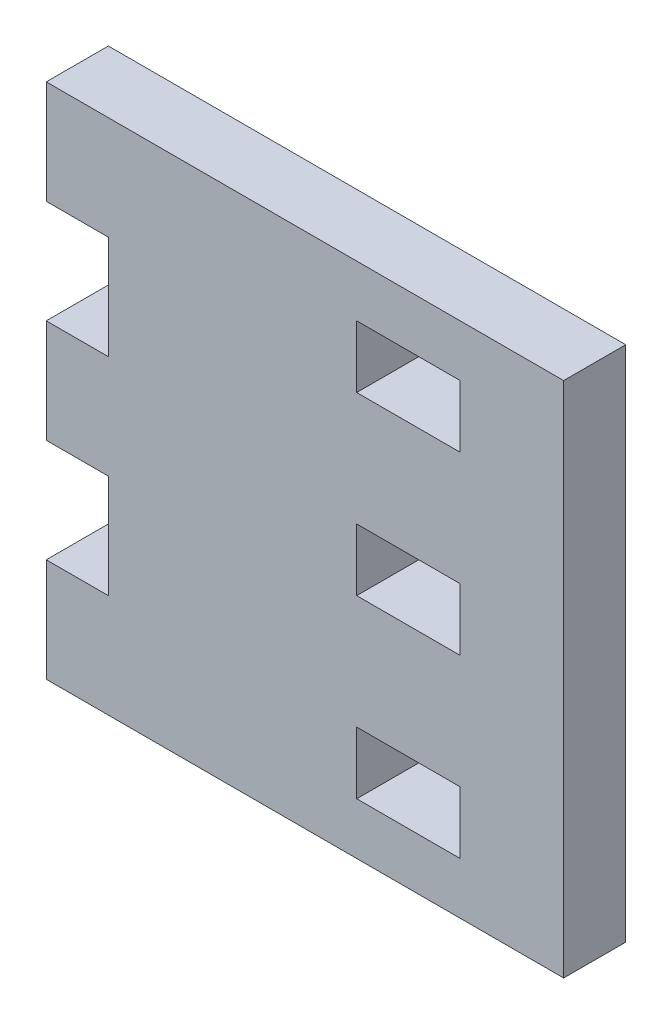
ISO-10303-21;
HEADER;
FILE_DESCRIPTION(('STEP AP214'),'2;1');
FILE_NAME('part.step','',(''),(''),'','','');
FILE_SCHEMA(('AUTOMOTIVE_DESIGN { 1 0 10303 214 1 1 1 1 }'));
ENDSEC;
DATA;
#1=APPLICATION_CONTEXT('core data for automotive mechanical design processes');
#2=APPLICATION_PROTOCOL_DEFINITION('international standard','automotive_design',2000,#1);
#3=PRODUCT_CONTEXT('',#1,'mechanical');
#4=PRODUCT('Part','Part','',(#3));
#5=PRODUCT_RELATED_PRODUCT_CATEGORY('part','',(#4));
#6=PRODUCT_DEFINITION_FORMATION('','',#4);
#7=PRODUCT_DEFINITION_CONTEXT('part definition',#1,'design');
#8=PRODUCT_DEFINITION('design','',#6,#7);
#9=PRODUCT_DEFINITION_SHAPE('','',#8);
#10=(LENGTH_UNIT() NAMED_UNIT(*) SI_UNIT(.MILLI.,.METRE.));
#11=(NAMED_UNIT(*) PLANE_ANGLE_UNIT() SI_UNIT($,.RADIAN.));
#12=(NAMED_UNIT(*) SI_UNIT($,.STERADIAN.) SOLID_ANGLE_UNIT());
#13=UNCERTAINTY_MEASURE_WITH_UNIT(LENGTH_MEASURE(1.E-05),#10,'distance_accuracy_value','');
#14=(GEOMETRIC_REPRESENTATION_CONTEXT(3) GLOBAL_UNCERTAINTY_ASSIGNED_CONTEXT((#13)) GLOBAL_UNIT_ASSIGNED_CONTEXT((#10,
#11,#12)) REPRESENTATION_CONTEXT('',''));
#15=CARTESIAN_POINT('',(0.,0.,0.));
#16=DIRECTION('',(0.,0.,1.));
#17=DIRECTION('',(1.,0.,0.));
#18=AXIS2_PLACEMENT_3D('',#15,#16,#17);
#19=CARTESIAN_POINT('',(0.,0.,6.));
#20=DIRECTION('',(0.,0.,1.));
#21=DIRECTION('',(1.,0.,0.));
#22=AXIS2_PLACEMENT_3D('',#19,#20,#21);
#23=PLANE('',#22);
#24=DIRECTION('',(0.,-1.,0.));
#25=VECTOR('',#24,1.);
#26=CARTESIAN_POINT('',(-26.3628985430743,32.763671875,6.));
#27=LINE('',#26,#25);
#28=CARTESIAN_POINT('',(-26.3628985430743,32.763671875,6.));
#29=VERTEX_POINT('',#28);
#30=CARTESIAN_POINT('',(-26.3628985430743,22.763671875,6.));
#31=VERTEX_POINT('',#30);
#32=EDGE_CURVE('E292',#29,#31,#27,.T.);
#33=ORIENTED_EDGE('',*,*,#32,.T.);
#34=DIRECTION('',(1.,0.,0.));
#35=VECTOR('',#34,1.);
#36=CARTESIAN_POINT('',(-26.3628985430743,22.763671875,6.));
#37=LINE('',#36,#35);
#38=CARTESIAN_POINT('',(-20.3628985430743,22.763671875,6.));
#39=VERTEX_POINT('',#38);
#40=EDGE_CURVE('E295',#31,#39,#37,.T.);
#41=ORIENTED_EDGE('',*,*,#40,.T.);
#42=DIRECTION('',(0.,-1.,0.));
#43=VECTOR('',#42,1.);
#44=CARTESIAN_POINT('',(-20.3628985430743,22.763671875,6.));
#45=LINE('',#44,#43);
#46=CARTESIAN_POINT('',(-20.3628985430743,12.763671875,6.));
#47=VERTEX_POINT('',#46);
#48=EDGE_CURVE('E298',#39,#47,#45,.T.);
#49=ORIENTED_EDGE('',*,*,#48,.T.);
#50=DIRECTION('',(-1.,0.,0.));
#51=VECTOR('',#50,1.);
#52=CARTESIAN_POINT('',(-26.3628985430743,12.763671875,6.));
#53=LINE('',#52,#51);
#54=CARTESIAN_POINT('',(-26.3628985430743,12.763671875,6.));
#55=VERTEX_POINT('',#54);
#56=EDGE_CURVE('E300',#47,#55,#53,.T.);
#57=ORIENTED_EDGE('',*,*,#56,.T.);
#58=DIRECTION('',(0.,-1.,0.));
#59=VECTOR('',#58,1.);
#60=CARTESIAN_POINT('',(-26.3628985430743,12.763671875,6.));
#61=LINE('',#60,#59);
#62=CARTESIAN_POINT('',(-26.362898543074,2.76367187500001,6.));
#63=VERTEX_POINT('',#62);
#64=EDGE_CURVE('E302',#55,#63,#61,.T.);
#65=ORIENTED_EDGE('',*,*,#64,.T.);
#66=DIRECTION('',(1.,0.,0.));
#67=VECTOR('',#66,1.);
#68=CARTESIAN_POINT('',(-26.362898543074,2.76367187500001,6.));
#69=LINE('',#68,#67);
#70=CARTESIAN_POINT('',(-20.362898543074,2.76367187500001,6.));
#71=VERTEX_POINT('',#70);
#72=EDGE_CURVE('E304',#63,#71,#69,.T.);
#73=ORIENTED_EDGE('',*,*,#72,.T.);
#74=DIRECTION('',(0.,-1.,0.));
#75=VECTOR('',#74,1.);
#76=CARTESIAN_POINT('',(-20.362898543074,2.76367187500001,6.));
#77=LINE('',#76,#75);
#78=CARTESIAN_POINT('',(-20.362898543074,-7.23632812499999,6.));
#79=VERTEX_POINT('',#78);
#80=EDGE_CURVE('E306',#71,#79,#77,.T.);
#81=ORIENTED_EDGE('',*,*,#80,.T.);
#82=DIRECTION('',(-1.,0.,0.));
#83=VECTOR('',#82,1.);
#84=CARTESIAN_POINT('',(-26.362898543074,-7.23632812499999,6.));
#85=LINE('',#84,#83);
#86=CARTESIAN_POINT('',(-26.362898543074,-7.23632812499999,6.));
#87=VERTEX_POINT('',#86);
#88=EDGE_CURVE('E308',#79,#87,#85,.T.);
#89=ORIENTED_EDGE('',*,*,#88,.T.);
#90=DIRECTION('',(0.,-1.,0.));
#91=VECTOR('',#90,1.);
#92=CARTESIAN_POINT('',(-26.362898543074,-7.23632812499999,6.));
#93=LINE('',#92,#91);
#94=CARTESIAN_POINT('',(-26.3628985430743,-17.236328125,6.));
#95=VERTEX_POINT('',#94);
#96=EDGE_CURVE('E310',#87,#95,#93,.T.);
#97=ORIENTED_EDGE('',*,*,#96,.T.);
#98=DIRECTION('',(1.,0.,0.));
#99=VECTOR('',#98,1.);
#100=CARTESIAN_POINT('',(-26.3628985430743,-17.236328125,6.));
#101=LINE('',#100,#99);
#102=CARTESIAN_POINT('',(23.6371014569257,-17.236328125,6.));
#103=VERTEX_POINT('',#102);
#104=EDGE_CURVE('E312',#95,#103,#101,.T.);
#105=ORIENTED_EDGE('',*,*,#104,.T.);
#106=DIRECTION('',(0.,1.,0.));
#107=VECTOR('',#106,1.);
#108=CARTESIAN_POINT('',(23.6371014569257,32.763671875,6.));
#109=LINE('',#108,#107);
#110=CARTESIAN_POINT('',(23.6371014569257,32.763671875,6.));
#111=VERTEX_POINT('',#110);
#112=EDGE_CURVE('E314',#103,#111,#109,.T.);
#113=ORIENTED_EDGE('',*,*,#112,.T.);
#114=DIRECTION('',(-1.,0.,0.));
#115=VECTOR('',#114,1.);
#116=CARTESIAN_POINT('',(-26.3628985430743,32.763671875,6.));
#117=LINE('',#116,#115);
#118=EDGE_CURVE('E316',#111,#29,#117,.T.);
#119=ORIENTED_EDGE('',*,*,#118,.T.);
#120=EDGE_LOOP('',(#33,#41,#49,#57,#65,#73,#81,#89,#97,#105,#113,#119));
#121=FACE_BOUND('',#120,.T.);
#122=DIRECTION('',(1.,0.,0.));
#123=VECTOR('',#122,1.);
#124=CARTESIAN_POINT('',(3.63710145692571,21.763671875,6.));
#125=LINE('',#124,#123);
#126=CARTESIAN_POINT('',(3.63710145692571,21.763671875,6.));
#127=VERTEX_POINT('',#126);
#128=CARTESIAN_POINT('',(13.6371014569257,21.763671875,6.));
#129=VERTEX_POINT('',#128);
#130=EDGE_CURVE('E263',#127,#129,#125,.T.);
#131=ORIENTED_EDGE('',*,*,#130,.F.);
#132=DIRECTION('',(0.,-1.,0.));
#133=VECTOR('',#132,1.);
#134=CARTESIAN_POINT('',(3.63710145692571,27.763671875,6.));
#135=LINE('',#134,#133);
#136=CARTESIAN_POINT('',(3.63710145692571,27.763671875,6.));
#137=VERTEX_POINT('',#136);
#138=EDGE_CURVE('E261',#137,#127,#135,.T.);
#139=ORIENTED_EDGE('',*,*,#138,.F.);
#140=DIRECTION('',(-1.,0.,0.));
#141=VECTOR('',#140,1.);
#142=CARTESIAN_POINT('',(3.63710145692571,27.763671875,6.));
#143=LINE('',#142,#141);
#144=CARTESIAN_POINT('',(13.6371014569257,27.763671875,6.));
#145=VERTEX_POINT('',#144);
#146=EDGE_CURVE('E269',#145,#137,#143,.T.);
#147=ORIENTED_EDGE('',*,*,#146,.F.);
#148=DIRECTION('',(0.,1.,0.));
#149=VECTOR('',#148,1.);
#150=CARTESIAN_POINT('',(13.6371014569257,27.763671875,6.));
#151=LINE('',#150,#149);
#152=EDGE_CURVE('E266',#129,#145,#151,.T.);
#153=ORIENTED_EDGE('',*,*,#152,.F.);
#154=EDGE_LOOP('',(#131,#139,#147,#153));
#155=FACE_BOUND('',#154,.T.);
#156=DIRECTION('',(0.,-1.,0.));
#157=VECTOR('',#156,1.);
#158=CARTESIAN_POINT('',(3.63710145692595,10.763671875,6.));
#159=LINE('',#158,#157);
#160=CARTESIAN_POINT('',(3.63710145692595,10.763671875,6.));
#161=VERTEX_POINT('',#160);
#162=CARTESIAN_POINT('',(3.63710145692595,4.76367187500002,6.));
#163=VERTEX_POINT('',#162);
#164=EDGE_CURVE('E232',#161,#163,#159,.T.);
#165=ORIENTED_EDGE('',*,*,#164,.F.);
#166=DIRECTION('',(-1.,0.,0.));
#167=VECTOR('',#166,1.);
#168=CARTESIAN_POINT('',(3.63710145692595,10.763671875,6.));
#169=LINE('',#168,#167);
#170=CARTESIAN_POINT('',(13.6371014569259,10.763671875,6.));
#171=VERTEX_POINT('',#170);
#172=EDGE_CURVE('E230',#171,#161,#169,.T.);
#173=ORIENTED_EDGE('',*,*,#172,.F.);
#174=DIRECTION('',(0.,1.,0.));
#175=VECTOR('',#174,1.);
#176=CARTESIAN_POINT('',(13.6371014569259,10.763671875,6.));
#177=LINE('',#176,#175);
#178=CARTESIAN_POINT('',(13.6371014569259,4.76367187500002,6.));
#179=VERTEX_POINT('',#178);
#180=EDGE_CURVE('E238',#179,#171,#177,.T.);
#181=ORIENTED_EDGE('',*,*,#180,.F.);
#182=DIRECTION('',(1.,0.,0.));
#183=VECTOR('',#182,1.);
#184=CARTESIAN_POINT('',(3.63710145692595,4.76367187500002,6.));
#185=LINE('',#184,#183);
#186=EDGE_CURVE('E235',#163,#179,#185,.T.);
#187=ORIENTED_EDGE('',*,*,#186,.F.);
#188=EDGE_LOOP('',(#165,#173,#181,#187));
#189=FACE_BOUND('',#188,.T.);
#190=DIRECTION('',(0.,-1.,0.));
#191=VECTOR('',#190,1.);
#192=CARTESIAN_POINT('',(3.63710145692618,-6.23632812499999,6.));
#193=LINE('',#192,#191);
#194=CARTESIAN_POINT('',(3.63710145692618,-6.23632812499999,6.));
#195=VERTEX_POINT('',#194);
#196=CARTESIAN_POINT('',(3.63710145692619,-12.236328125,6.));
#197=VERTEX_POINT('',#196);
#198=EDGE_CURVE('E202',#195,#197,#193,.T.);
#199=ORIENTED_EDGE('',*,*,#198,.F.);
#200=DIRECTION('',(-1.,0.,0.));
#201=VECTOR('',#200,1.);
#202=CARTESIAN_POINT('',(3.63710145692618,-6.23632812499999,6.));
#203=LINE('',#202,#201);
#204=CARTESIAN_POINT('',(13.6371014569262,-6.23632812499998,6.));
#205=VERTEX_POINT('',#204);
#206=EDGE_CURVE('E194',#205,#195,#203,.T.);
#207=ORIENTED_EDGE('',*,*,#206,.F.);
#208=DIRECTION('',(0.,1.,0.));
#209=VECTOR('',#208,1.);
#210=CARTESIAN_POINT('',(13.6371014569262,-6.23632812499998,6.));
#211=LINE('',#210,#209);
#212=CARTESIAN_POINT('',(13.6371014569262,-12.236328125,6.));
#213=VERTEX_POINT('',#212);
#214=EDGE_CURVE('E216',#213,#205,#211,.T.);
#215=ORIENTED_EDGE('',*,*,#214,.F.);
#216=DIRECTION('',(1.,0.,0.));
#217=VECTOR('',#216,1.);
#218=CARTESIAN_POINT('',(3.63710145692619,-12.236328125,6.));
#219=LINE('',#218,#217);
#220=EDGE_CURVE('E214',#197,#213,#219,.T.);
#221=ORIENTED_EDGE('',*,*,#220,.F.);
#222=EDGE_LOOP('',(#199,#207,#215,#221));
#223=FACE_BOUND('',#222,.T.);
#224=ADVANCED_FACE('F33',(#121,#155,#189,#223),#23,.T.);
#225=CARTESIAN_POINT('',(0.,0.,0.));
#226=DIRECTION('',(0.,0.,1.));
#227=DIRECTION('',(1.,0.,0.));
#228=AXIS2_PLACEMENT_3D('',#225,#226,#227);
#229=PLANE('',#228);
#230=DIRECTION('',(-1.,0.,0.));
#231=VECTOR('',#230,1.);
#232=CARTESIAN_POINT('',(3.63710145692595,10.763671875,0.));
#233=LINE('',#232,#231);
#234=CARTESIAN_POINT('',(13.6371014569259,10.763671875,0.));
#235=VERTEX_POINT('',#234);
#236=CARTESIAN_POINT('',(3.63710145692595,10.763671875,0.));
#237=VERTEX_POINT('',#236);
#238=EDGE_CURVE('E210',#235,#237,#233,.T.);
#239=ORIENTED_EDGE('',*,*,#238,.T.);
#240=DIRECTION('',(0.,-1.,0.));
#241=VECTOR('',#240,1.);
#242=CARTESIAN_POINT('',(3.63710145692595,10.763671875,0.));
#243=LINE('',#242,#241);
#244=CARTESIAN_POINT('',(3.63710145692595,4.76367187500002,0.));
#245=VERTEX_POINT('',#244);
#246=EDGE_CURVE('E243',#237,#245,#243,.T.);
#247=ORIENTED_EDGE('',*,*,#246,.T.);
#248=DIRECTION('',(1.,0.,0.));
#249=VECTOR('',#248,1.);
#250=CARTESIAN_POINT('',(3.63710145692595,4.76367187500002,0.));
#251=LINE('',#250,#249);
#252=CARTESIAN_POINT('',(13.6371014569259,4.76367187500002,0.));
#253=VERTEX_POINT('',#252);
#254=EDGE_CURVE('E246',#245,#253,#251,.T.);
#255=ORIENTED_EDGE('',*,*,#254,.T.);
#256=DIRECTION('',(0.,1.,0.));
#257=VECTOR('',#256,1.);
#258=CARTESIAN_POINT('',(13.6371014569259,10.763671875,0.));
#259=LINE('',#258,#257);
#260=EDGE_CURVE('E233',#253,#235,#259,.T.);
#261=ORIENTED_EDGE('',*,*,#260,.T.);
#262=EDGE_LOOP('',(#239,#247,#255,#261));
#263=FACE_BOUND('',#262,.T.);
#264=DIRECTION('',(0.,-1.,0.));
#265=VECTOR('',#264,1.);
#266=CARTESIAN_POINT('',(-26.3628985430743,32.763671875,0.));
#267=LINE('',#266,#265);
#268=CARTESIAN_POINT('',(-26.3628985430743,32.763671875,0.));
#269=VERTEX_POINT('',#268);
#270=CARTESIAN_POINT('',(-26.3628985430743,22.763671875,0.));
#271=VERTEX_POINT('',#270);
#272=EDGE_CURVE('E291',#269,#271,#267,.T.);
#273=ORIENTED_EDGE('',*,*,#272,.F.);
#274=DIRECTION('',(-1.,0.,0.));
#275=VECTOR('',#274,1.);
#276=CARTESIAN_POINT('',(-26.3628985430743,32.763671875,0.));
#277=LINE('',#276,#275);
#278=CARTESIAN_POINT('',(23.6371014569257,32.763671875,0.));
#279=VERTEX_POINT('',#278);
#280=EDGE_CURVE('E296',#279,#269,#277,.T.);
#281=ORIENTED_EDGE('',*,*,#280,.F.);
#282=DIRECTION('',(0.,1.,0.));
#283=VECTOR('',#282,1.);
#284=CARTESIAN_POINT('',(23.6371014569257,32.763671875,0.));
#285=LINE('',#284,#283);
#286=CARTESIAN_POINT('',(23.6371014569257,-17.236328125,0.));
#287=VERTEX_POINT('',#286);
#288=EDGE_CURVE('E339',#287,#279,#285,.T.);
#289=ORIENTED_EDGE('',*,*,#288,.F.);
#290=DIRECTION('',(1.,0.,0.));
#291=VECTOR('',#290,1.);
#292=CARTESIAN_POINT('',(-26.3628985430743,-17.236328125,0.));
#293=LINE('',#292,#291);
#294=CARTESIAN_POINT('',(-26.3628985430743,-17.236328125,0.));
#295=VERTEX_POINT('',#294);
#296=EDGE_CURVE('E337',#295,#287,#293,.T.);
#297=ORIENTED_EDGE('',*,*,#296,.F.);
#298=DIRECTION('',(0.,-1.,0.));
#299=VECTOR('',#298,1.);
#300=CARTESIAN_POINT('',(-26.362898543074,-7.23632812499999,0.));
#301=LINE('',#300,#299);
#302=CARTESIAN_POINT('',(-26.362898543074,-7.23632812499999,0.));
#303=VERTEX_POINT('',#302);
#304=EDGE_CURVE('E335',#303,#295,#301,.T.);
#305=ORIENTED_EDGE('',*,*,#304,.F.);
#306=DIRECTION('',(-1.,0.,0.));
#307=VECTOR('',#306,1.);
#308=CARTESIAN_POINT('',(-26.362898543074,-7.23632812499999,0.));
#309=LINE('',#308,#307);
#310=CARTESIAN_POINT('',(-20.362898543074,-7.23632812499999,0.));
#311=VERTEX_POINT('',#310);
#312=EDGE_CURVE('E333',#311,#303,#309,.T.);
#313=ORIENTED_EDGE('',*,*,#312,.F.);
#314=DIRECTION('',(0.,-1.,0.));
#315=VECTOR('',#314,1.);
#316=CARTESIAN_POINT('',(-20.362898543074,2.76367187500001,0.));
#317=LINE('',#316,#315);
#318=CARTESIAN_POINT('',(-20.362898543074,2.76367187500001,0.));
#319=VERTEX_POINT('',#318);
#320=EDGE_CURVE('E331',#319,#311,#317,.T.);
#321=ORIENTED_EDGE('',*,*,#320,.F.);
#322=DIRECTION('',(1.,0.,0.));
#323=VECTOR('',#322,1.);
#324=CARTESIAN_POINT('',(-26.362898543074,2.76367187500001,0.));
#325=LINE('',#324,#323);
#326=CARTESIAN_POINT('',(-26.362898543074,2.76367187500001,0.));
#327=VERTEX_POINT('',#326);
#328=EDGE_CURVE('E329',#327,#319,#325,.T.);
#329=ORIENTED_EDGE('',*,*,#328,.F.);
#330=DIRECTION('',(0.,-1.,0.));
#331=VECTOR('',#330,1.);
#332=CARTESIAN_POINT('',(-26.3628985430743,12.763671875,0.));
#333=LINE('',#332,#331);
#334=CARTESIAN_POINT('',(-26.3628985430743,12.763671875,0.));
#335=VERTEX_POINT('',#334);
#336=EDGE_CURVE('E327',#335,#327,#333,.T.);
#337=ORIENTED_EDGE('',*,*,#336,.F.);
#338=DIRECTION('',(-1.,0.,0.));
#339=VECTOR('',#338,1.);
#340=CARTESIAN_POINT('',(-26.3628985430743,12.763671875,0.));
#341=LINE('',#340,#339);
#342=CARTESIAN_POINT('',(-20.3628985430743,12.763671875,0.));
#343=VERTEX_POINT('',#342);
#344=EDGE_CURVE('E325',#343,#335,#341,.T.);
#345=ORIENTED_EDGE('',*,*,#344,.F.);
#346=DIRECTION('',(0.,-1.,0.));
#347=VECTOR('',#346,1.);
#348=CARTESIAN_POINT('',(-20.3628985430743,22.763671875,0.));
#349=LINE('',#348,#347);
#350=CARTESIAN_POINT('',(-20.3628985430743,22.763671875,0.));
#351=VERTEX_POINT('',#350);
#352=EDGE_CURVE('E323',#351,#343,#349,.T.);
#353=ORIENTED_EDGE('',*,*,#352,.F.);
#354=DIRECTION('',(1.,0.,0.));
#355=VECTOR('',#354,1.);
#356=CARTESIAN_POINT('',(-26.3628985430743,22.763671875,0.));
#357=LINE('',#356,#355);
#358=EDGE_CURVE('E321',#271,#351,#357,.T.);
#359=ORIENTED_EDGE('',*,*,#358,.F.);
#360=EDGE_LOOP('',(#273,#281,#289,#297,#305,#313,#321,#329,#337,#345,#353,#359));
#361=FACE_BOUND('',#360,.T.);
#362=DIRECTION('',(0.,-1.,0.));
#363=VECTOR('',#362,1.);
#364=CARTESIAN_POINT('',(3.63710145692571,27.763671875,0.));
#365=LINE('',#364,#363);
#366=CARTESIAN_POINT('',(3.63710145692571,27.763671875,0.));
#367=VERTEX_POINT('',#366);
#368=CARTESIAN_POINT('',(3.63710145692571,21.763671875,0.));
#369=VERTEX_POINT('',#368);
#370=EDGE_CURVE('E260',#367,#369,#365,.T.);
#371=ORIENTED_EDGE('',*,*,#370,.T.);
#372=DIRECTION('',(1.,0.,0.));
#373=VECTOR('',#372,1.);
#374=CARTESIAN_POINT('',(3.63710145692571,21.763671875,0.));
#375=LINE('',#374,#373);
#376=CARTESIAN_POINT('',(13.6371014569257,21.763671875,0.));
#377=VERTEX_POINT('',#376);
#378=EDGE_CURVE('E274',#369,#377,#375,.T.);
#379=ORIENTED_EDGE('',*,*,#378,.T.);
#380=DIRECTION('',(0.,1.,0.));
#381=VECTOR('',#380,1.);
#382=CARTESIAN_POINT('',(13.6371014569257,27.763671875,0.));
#383=LINE('',#382,#381);
#384=CARTESIAN_POINT('',(13.6371014569257,27.763671875,0.));
#385=VERTEX_POINT('',#384);
#386=EDGE_CURVE('E277',#377,#385,#383,.T.);
#387=ORIENTED_EDGE('',*,*,#386,.T.);
#388=DIRECTION('',(-1.,0.,0.));
#389=VECTOR('',#388,1.);
#390=CARTESIAN_POINT('',(3.63710145692571,27.763671875,0.));
#391=LINE('',#390,#389);
#392=EDGE_CURVE('E264',#385,#367,#391,.T.);
#393=ORIENTED_EDGE('',*,*,#392,.T.);
#394=EDGE_LOOP('',(#371,#379,#387,#393));
#395=FACE_BOUND('',#394,.T.);
#396=DIRECTION('',(-1.,0.,0.));
#397=VECTOR('',#396,1.);
#398=CARTESIAN_POINT('',(3.63710145692618,-6.23632812499999,0.));
#399=LINE('',#398,#397);
#400=CARTESIAN_POINT('',(13.6371014569262,-6.23632812499998,0.));
#401=VERTEX_POINT('',#400);
#402=CARTESIAN_POINT('',(3.63710145692618,-6.23632812499999,0.));
#403=VERTEX_POINT('',#402);
#404=EDGE_CURVE('E56',#401,#403,#399,.T.);
#405=ORIENTED_EDGE('',*,*,#404,.T.);
#406=DIRECTION('',(0.,-1.,0.));
#407=VECTOR('',#406,1.);
#408=CARTESIAN_POINT('',(3.63710145692618,-6.23632812499999,0.));
#409=LINE('',#408,#407);
#410=CARTESIAN_POINT('',(3.63710145692619,-12.236328125,0.));
#411=VERTEX_POINT('',#410);
#412=EDGE_CURVE('E209',#403,#411,#409,.T.);
#413=ORIENTED_EDGE('',*,*,#412,.T.);
#414=DIRECTION('',(1.,0.,0.));
#415=VECTOR('',#414,1.);
#416=CARTESIAN_POINT('',(3.63710145692619,-12.236328125,0.));
#417=LINE('',#416,#415);
#418=CARTESIAN_POINT('',(13.6371014569262,-12.236328125,0.));
#419=VERTEX_POINT('',#418);
#420=EDGE_CURVE('E222',#411,#419,#417,.T.);
#421=ORIENTED_EDGE('',*,*,#420,.T.);
#422=DIRECTION('',(0.,1.,0.));
#423=VECTOR('',#422,1.);
#424=CARTESIAN_POINT('',(13.6371014569262,-6.23632812499998,0.));
#425=LINE('',#424,#423);
#426=EDGE_CURVE('E203',#419,#401,#425,.T.);
#427=ORIENTED_EDGE('',*,*,#426,.T.);
#428=EDGE_LOOP('',(#405,#413,#421,#427));
#429=FACE_BOUND('',#428,.T.);
#430=ADVANCED_FACE('F381',(#263,#361,#395,#429),#229,.F.);
#431=CARTESIAN_POINT('',(-26.3628985430743,32.763671875,6.));
#432=DIRECTION('',(1.,0.,0.));
#433=DIRECTION('',(0.,0.,-1.));
#434=AXIS2_PLACEMENT_3D('',#431,#432,#433);
#435=PLANE('',#434);
#436=ORIENTED_EDGE('',*,*,#272,.T.);
#437=DIRECTION('',(0.,0.,-1.));
#438=VECTOR('',#437,1.);
#439=CARTESIAN_POINT('',(-26.3628985430743,22.763671875,6.));
#440=LINE('',#439,#438);
#441=EDGE_CURVE('E11',#31,#271,#440,.T.);
#442=ORIENTED_EDGE('',*,*,#441,.F.);
#443=ORIENTED_EDGE('',*,*,#32,.F.);
#444=DIRECTION('',(0.,0.,-1.));
#445=VECTOR('',#444,1.);
#446=CARTESIAN_POINT('',(-26.3628985430743,32.763671875,6.));
#447=LINE('',#446,#445);
#448=EDGE_CURVE('E318',#29,#269,#447,.T.);
#449=ORIENTED_EDGE('',*,*,#448,.T.);
#450=EDGE_LOOP('',(#436,#442,#443,#449));
#451=FACE_BOUND('',#450,.T.);
#452=ADVANCED_FACE('F35',(#451),#435,.F.);
#453=CARTESIAN_POINT('',(-26.3628985430743,22.763671875,6.));
#454=DIRECTION('',(0.,1.,0.));
#455=DIRECTION('',(0.,0.,1.));
#456=AXIS2_PLACEMENT_3D('',#453,#454,#455);
#457=PLANE('',#456);
#458=ORIENTED_EDGE('',*,*,#358,.T.);
#459=DIRECTION('',(0.,0.,-1.));
#460=VECTOR('',#459,1.);
#461=CARTESIAN_POINT('',(-20.3628985430743,22.763671875,6.));
#462=LINE('',#461,#460);
#463=EDGE_CURVE('E41',#39,#351,#462,.T.);
#464=ORIENTED_EDGE('',*,*,#463,.F.);
#465=ORIENTED_EDGE('',*,*,#40,.F.);
#466=ORIENTED_EDGE('',*,*,#441,.T.);
#467=EDGE_LOOP('',(#458,#464,#465,#466));
#468=FACE_BOUND('',#467,.T.);
#469=ADVANCED_FACE('F399',(#468),#457,.F.);
#470=CARTESIAN_POINT('',(-20.3628985430743,22.763671875,6.));
#471=DIRECTION('',(1.,0.,0.));
#472=DIRECTION('',(0.,0.,-1.));
#473=AXIS2_PLACEMENT_3D('',#470,#471,#472);
#474=PLANE('',#473);
#475=ORIENTED_EDGE('',*,*,#352,.T.);
#476=DIRECTION('',(0.,0.,-1.));
#477=VECTOR('',#476,1.);
#478=CARTESIAN_POINT('',(-20.3628985430743,12.763671875,6.));
#479=LINE('',#478,#477);
#480=EDGE_CURVE('E368',#47,#343,#479,.T.);
#481=ORIENTED_EDGE('',*,*,#480,.F.);
#482=ORIENTED_EDGE('',*,*,#48,.F.);
#483=ORIENTED_EDGE('',*,*,#463,.T.);
#484=EDGE_LOOP('',(#475,#481,#482,#483));
#485=FACE_BOUND('',#484,.T.);
#486=ADVANCED_FACE('F375',(#485),#474,.F.);
#487=CARTESIAN_POINT('',(-26.3628985430743,12.763671875,6.));
#488=DIRECTION('',(0.,-1.,0.));
#489=DIRECTION('',(0.,0.,-1.));
#490=AXIS2_PLACEMENT_3D('',#487,#488,#489);
#491=PLANE('',#490);
#492=ORIENTED_EDGE('',*,*,#344,.T.);
#493=DIRECTION('',(0.,0.,-1.));
#494=VECTOR('',#493,1.);
#495=CARTESIAN_POINT('',(-26.3628985430743,12.763671875,6.));
#496=LINE('',#495,#494);
#497=EDGE_CURVE('E365',#55,#335,#496,.T.);
#498=ORIENTED_EDGE('',*,*,#497,.F.);
#499=ORIENTED_EDGE('',*,*,#56,.F.);
#500=ORIENTED_EDGE('',*,*,#480,.T.);
#501=EDGE_LOOP('',(#492,#498,#499,#500));
#502=FACE_BOUND('',#501,.T.);
#503=ADVANCED_FACE('F387',(#502),#491,.F.);
#504=CARTESIAN_POINT('',(-26.3628985430743,12.763671875,6.));
#505=DIRECTION('',(1.,0.,0.));
#506=DIRECTION('',(0.,1.,0.));
#507=AXIS2_PLACEMENT_3D('',#504,#505,#506);
#508=PLANE('',#507);
#509=ORIENTED_EDGE('',*,*,#336,.T.);
#510=DIRECTION('',(0.,0.,-1.));
#511=VECTOR('',#510,1.);
#512=CARTESIAN_POINT('',(-26.362898543074,2.76367187500001,6.));
#513=LINE('',#512,#511);
#514=EDGE_CURVE('E362',#63,#327,#513,.T.);
#515=ORIENTED_EDGE('',*,*,#514,.F.);
#516=ORIENTED_EDGE('',*,*,#64,.F.);
#517=ORIENTED_EDGE('',*,*,#497,.T.);
#518=EDGE_LOOP('',(#509,#515,#516,#517));
#519=FACE_BOUND('',#518,.T.);
#520=ADVANCED_FACE('F391',(#519),#508,.F.);
#521=CARTESIAN_POINT('',(-26.362898543074,2.76367187500001,6.));
#522=DIRECTION('',(0.,1.,0.));
#523=DIRECTION('',(0.,0.,1.));
#524=AXIS2_PLACEMENT_3D('',#521,#522,#523);
#525=PLANE('',#524);
#526=ORIENTED_EDGE('',*,*,#328,.T.);
#527=DIRECTION('',(0.,0.,-1.));
#528=VECTOR('',#527,1.);
#529=CARTESIAN_POINT('',(-20.362898543074,2.76367187500001,6.));
#530=LINE('',#529,#528);
#531=EDGE_CURVE('E359',#71,#319,#530,.T.);
#532=ORIENTED_EDGE('',*,*,#531,.F.);
#533=ORIENTED_EDGE('',*,*,#72,.F.);
#534=ORIENTED_EDGE('',*,*,#514,.T.);
#535=EDGE_LOOP('',(#526,#532,#533,#534));
#536=FACE_BOUND('',#535,.T.);
#537=ADVANCED_FACE('F432',(#536),#525,.F.);
#538=CARTESIAN_POINT('',(-20.362898543074,2.76367187500001,6.));
#539=DIRECTION('',(1.,0.,0.));
#540=DIRECTION('',(0.,0.,-1.));
#541=AXIS2_PLACEMENT_3D('',#538,#539,#540);
#542=PLANE('',#541);
#543=ORIENTED_EDGE('',*,*,#320,.T.);
#544=DIRECTION('',(0.,0.,-1.));
#545=VECTOR('',#544,1.);
#546=CARTESIAN_POINT('',(-20.362898543074,-7.23632812499999,6.));
#547=LINE('',#546,#545);
#548=EDGE_CURVE('E356',#79,#311,#547,.T.);
#549=ORIENTED_EDGE('',*,*,#548,.F.);
#550=ORIENTED_EDGE('',*,*,#80,.F.);
#551=ORIENTED_EDGE('',*,*,#531,.T.);
#552=EDGE_LOOP('',(#543,#549,#550,#551));
#553=FACE_BOUND('',#552,.T.);
#554=ADVANCED_FACE('F430',(#553),#542,.F.);
#555=CARTESIAN_POINT('',(-26.362898543074,-7.23632812499999,6.));
#556=DIRECTION('',(0.,-1.,0.));
#557=DIRECTION('',(0.,0.,-1.));
#558=AXIS2_PLACEMENT_3D('',#555,#556,#557);
#559=PLANE('',#558);
#560=ORIENTED_EDGE('',*,*,#312,.T.);
#561=DIRECTION('',(0.,0.,-1.));
#562=VECTOR('',#561,1.);
#563=CARTESIAN_POINT('',(-26.362898543074,-7.23632812499999,6.));
#564=LINE('',#563,#562);
#565=EDGE_CURVE('E353',#87,#303,#564,.T.);
#566=ORIENTED_EDGE('',*,*,#565,.F.);
#567=ORIENTED_EDGE('',*,*,#88,.F.);
#568=ORIENTED_EDGE('',*,*,#548,.T.);
#569=EDGE_LOOP('',(#560,#566,#567,#568));
#570=FACE_BOUND('',#569,.T.);
#571=ADVANCED_FACE('F426',(#570),#559,.F.);
#572=CARTESIAN_POINT('',(-26.362898543074,-7.23632812499999,6.));
#573=DIRECTION('',(1.,0.,0.));
#574=DIRECTION('',(0.,1.,0.));
#575=AXIS2_PLACEMENT_3D('',#572,#573,#574);
#576=PLANE('',#575);
#577=ORIENTED_EDGE('',*,*,#304,.T.);
#578=DIRECTION('',(0.,0.,-1.));
#579=VECTOR('',#578,1.);
#580=CARTESIAN_POINT('',(-26.3628985430743,-17.236328125,6.));
#581=LINE('',#580,#579);
#582=EDGE_CURVE('E350',#95,#295,#581,.T.);
#583=ORIENTED_EDGE('',*,*,#582,.F.);
#584=ORIENTED_EDGE('',*,*,#96,.F.);
#585=ORIENTED_EDGE('',*,*,#565,.T.);
#586=EDGE_LOOP('',(#577,#583,#584,#585));
#587=FACE_BOUND('',#586,.T.);
#588=ADVANCED_FACE('F421',(#587),#576,.F.);
#589=CARTESIAN_POINT('',(-26.3628985430743,-17.236328125,6.));
#590=DIRECTION('',(0.,1.,0.));
#591=DIRECTION('',(0.,0.,1.));
#592=AXIS2_PLACEMENT_3D('',#589,#590,#591);
#593=PLANE('',#592);
#594=ORIENTED_EDGE('',*,*,#296,.T.);
#595=DIRECTION('',(0.,0.,-1.));
#596=VECTOR('',#595,1.);
#597=CARTESIAN_POINT('',(23.6371014569257,-17.236328125,6.));
#598=LINE('',#597,#596);
#599=EDGE_CURVE('E347',#103,#287,#598,.T.);
#600=ORIENTED_EDGE('',*,*,#599,.F.);
#601=ORIENTED_EDGE('',*,*,#104,.F.);
#602=ORIENTED_EDGE('',*,*,#582,.T.);
#603=EDGE_LOOP('',(#594,#600,#601,#602));
#604=FACE_BOUND('',#603,.T.);
#605=ADVANCED_FACE('F415',(#604),#593,.F.);
#606=CARTESIAN_POINT('',(23.6371014569257,32.763671875,6.));
#607=DIRECTION('',(-1.,0.,0.));
#608=DIRECTION('',(0.,-1.,0.));
#609=AXIS2_PLACEMENT_3D('',#606,#607,#608);
#610=PLANE('',#609);
#611=ORIENTED_EDGE('',*,*,#288,.T.);
#612=DIRECTION('',(0.,0.,-1.));
#613=VECTOR('',#612,1.);
#614=CARTESIAN_POINT('',(23.6371014569257,32.763671875,6.));
#615=LINE('',#614,#613);
#616=EDGE_CURVE('E344',#111,#279,#615,.T.);
#617=ORIENTED_EDGE('',*,*,#616,.F.);
#618=ORIENTED_EDGE('',*,*,#112,.F.);
#619=ORIENTED_EDGE('',*,*,#599,.T.);
#620=EDGE_LOOP('',(#611,#617,#618,#619));
#621=FACE_BOUND('',#620,.T.);
#622=ADVANCED_FACE('F411',(#621),#610,.F.);
#623=CARTESIAN_POINT('',(-26.3628985430743,32.763671875,6.));
#624=DIRECTION('',(0.,-1.,0.));
#625=DIRECTION('',(0.,0.,-1.));
#626=AXIS2_PLACEMENT_3D('',#623,#624,#625);
#627=PLANE('',#626);
#628=ORIENTED_EDGE('',*,*,#280,.T.);
#629=ORIENTED_EDGE('',*,*,#448,.F.);
#630=ORIENTED_EDGE('',*,*,#118,.F.);
#631=ORIENTED_EDGE('',*,*,#616,.T.);
#632=EDGE_LOOP('',(#628,#629,#630,#631));
#633=FACE_BOUND('',#632,.T.);
#634=ADVANCED_FACE('F406',(#633),#627,.F.);
#635=CARTESIAN_POINT('',(3.63710145692571,27.763671875,6.));
#636=DIRECTION('',(1.,0.,0.));
#637=DIRECTION('',(0.,1.,0.));
#638=AXIS2_PLACEMENT_3D('',#635,#636,#637);
#639=PLANE('',#638);
#640=ORIENTED_EDGE('',*,*,#370,.F.);
#641=DIRECTION('',(0.,0.,-1.));
#642=VECTOR('',#641,1.);
#643=CARTESIAN_POINT('',(3.63710145692571,27.763671875,6.));
#644=LINE('',#643,#642);
#645=EDGE_CURVE('E271',#137,#367,#644,.T.);
#646=ORIENTED_EDGE('',*,*,#645,.F.);
#647=ORIENTED_EDGE('',*,*,#138,.T.);
#648=DIRECTION('',(0.,0.,-1.));
#649=VECTOR('',#648,1.);
#650=CARTESIAN_POINT('',(3.63710145692571,21.763671875,6.));
#651=LINE('',#650,#649);
#652=EDGE_CURVE('E288',#127,#369,#651,.T.);
#653=ORIENTED_EDGE('',*,*,#652,.T.);
#654=EDGE_LOOP('',(#640,#646,#647,#653));
#655=FACE_BOUND('',#654,.T.);
#656=ADVANCED_FACE('F449',(#655),#639,.T.);
#657=CARTESIAN_POINT('',(3.63710145692571,21.763671875,6.));
#658=DIRECTION('',(0.,1.,0.));
#659=DIRECTION('',(-1.,0.,0.));
#660=AXIS2_PLACEMENT_3D('',#657,#658,#659);
#661=PLANE('',#660);
#662=ORIENTED_EDGE('',*,*,#378,.F.);
#663=ORIENTED_EDGE('',*,*,#652,.F.);
#664=ORIENTED_EDGE('',*,*,#130,.T.);
#665=DIRECTION('',(0.,0.,-1.));
#666=VECTOR('',#665,1.);
#667=CARTESIAN_POINT('',(13.6371014569257,21.763671875,6.));
#668=LINE('',#667,#666);
#669=EDGE_CURVE('E286',#129,#377,#668,.T.);
#670=ORIENTED_EDGE('',*,*,#669,.T.);
#671=EDGE_LOOP('',(#662,#663,#664,#670));
#672=FACE_BOUND('',#671,.T.);
#673=ADVANCED_FACE('F487',(#672),#661,.T.);
#674=CARTESIAN_POINT('',(13.6371014569257,27.763671875,6.));
#675=DIRECTION('',(-1.,0.,0.));
#676=DIRECTION('',(0.,-1.,0.));
#677=AXIS2_PLACEMENT_3D('',#674,#675,#676);
#678=PLANE('',#677);
#679=ORIENTED_EDGE('',*,*,#386,.F.);
#680=ORIENTED_EDGE('',*,*,#669,.F.);
#681=ORIENTED_EDGE('',*,*,#152,.T.);
#682=DIRECTION('',(0.,0.,-1.));
#683=VECTOR('',#682,1.);
#684=CARTESIAN_POINT('',(13.6371014569257,27.763671875,6.));
#685=LINE('',#684,#683);
#686=EDGE_CURVE('E284',#145,#385,#685,.T.);
#687=ORIENTED_EDGE('',*,*,#686,.T.);
#688=EDGE_LOOP('',(#679,#680,#681,#687));
#689=FACE_BOUND('',#688,.T.);
#690=ADVANCED_FACE('F494',(#689),#678,.T.);
#691=CARTESIAN_POINT('',(3.63710145692571,27.763671875,6.));
#692=DIRECTION('',(0.,-1.,0.));
#693=DIRECTION('',(1.,0.,0.));
#694=AXIS2_PLACEMENT_3D('',#691,#692,#693);
#695=PLANE('',#694);
#696=ORIENTED_EDGE('',*,*,#392,.F.);
#697=ORIENTED_EDGE('',*,*,#686,.F.);
#698=ORIENTED_EDGE('',*,*,#146,.T.);
#699=ORIENTED_EDGE('',*,*,#645,.T.);
#700=EDGE_LOOP('',(#696,#697,#698,#699));
#701=FACE_BOUND('',#700,.T.);
#702=ADVANCED_FACE('F501',(#701),#695,.T.);
#703=CARTESIAN_POINT('',(3.63710145692595,10.763671875,6.));
#704=DIRECTION('',(0.,-1.,0.));
#705=DIRECTION('',(1.,0.,0.));
#706=AXIS2_PLACEMENT_3D('',#703,#704,#705);
#707=PLANE('',#706);
#708=ORIENTED_EDGE('',*,*,#238,.F.);
#709=DIRECTION('',(0.,0.,-1.));
#710=VECTOR('',#709,1.);
#711=CARTESIAN_POINT('',(13.6371014569259,10.763671875,6.));
#712=LINE('',#711,#710);
#713=EDGE_CURVE('E240',#171,#235,#712,.T.);
#714=ORIENTED_EDGE('',*,*,#713,.F.);
#715=ORIENTED_EDGE('',*,*,#172,.T.);
#716=DIRECTION('',(0.,0.,-1.));
#717=VECTOR('',#716,1.);
#718=CARTESIAN_POINT('',(3.63710145692595,10.763671875,6.));
#719=LINE('',#718,#717);
#720=EDGE_CURVE('E257',#161,#237,#719,.T.);
#721=ORIENTED_EDGE('',*,*,#720,.T.);
#722=EDGE_LOOP('',(#708,#714,#715,#721));
#723=FACE_BOUND('',#722,.T.);
#724=ADVANCED_FACE('F509',(#723),#707,.T.);
#725=CARTESIAN_POINT('',(3.63710145692595,10.763671875,6.));
#726=DIRECTION('',(1.,0.,0.));
#727=DIRECTION('',(0.,1.,0.));
#728=AXIS2_PLACEMENT_3D('',#725,#726,#727);
#729=PLANE('',#728);
#730=ORIENTED_EDGE('',*,*,#246,.F.);
#731=ORIENTED_EDGE('',*,*,#720,.F.);
#732=ORIENTED_EDGE('',*,*,#164,.T.);
#733=DIRECTION('',(0.,0.,-1.));
#734=VECTOR('',#733,1.);
#735=CARTESIAN_POINT('',(3.63710145692595,4.76367187500002,6.));
#736=LINE('',#735,#734);
#737=EDGE_CURVE('E255',#163,#245,#736,.T.);
#738=ORIENTED_EDGE('',*,*,#737,.T.);
#739=EDGE_LOOP('',(#730,#731,#732,#738));
#740=FACE_BOUND('',#739,.T.);
#741=ADVANCED_FACE('F517',(#740),#729,.T.);
#742=CARTESIAN_POINT('',(3.63710145692595,4.76367187500002,6.));
#743=DIRECTION('',(0.,1.,0.));
#744=DIRECTION('',(0.,0.,1.));
#745=AXIS2_PLACEMENT_3D('',#742,#743,#744);
#746=PLANE('',#745);
#747=ORIENTED_EDGE('',*,*,#254,.F.);
#748=ORIENTED_EDGE('',*,*,#737,.F.);
#749=ORIENTED_EDGE('',*,*,#186,.T.);
#750=DIRECTION('',(0.,0.,-1.));
#751=VECTOR('',#750,1.);
#752=CARTESIAN_POINT('',(13.6371014569259,4.76367187500002,6.));
#753=LINE('',#752,#751);
#754=EDGE_CURVE('E253',#179,#253,#753,.T.);
#755=ORIENTED_EDGE('',*,*,#754,.T.);
#756=EDGE_LOOP('',(#747,#748,#749,#755));
#757=FACE_BOUND('',#756,.T.);
#758=ADVANCED_FACE('F525',(#757),#746,.T.);
#759=CARTESIAN_POINT('',(13.6371014569259,10.763671875,6.));
#760=DIRECTION('',(-1.,0.,0.));
#761=DIRECTION('',(0.,-1.,0.));
#762=AXIS2_PLACEMENT_3D('',#759,#760,#761);
#763=PLANE('',#762);
#764=ORIENTED_EDGE('',*,*,#260,.F.);
#765=ORIENTED_EDGE('',*,*,#754,.F.);
#766=ORIENTED_EDGE('',*,*,#180,.T.);
#767=ORIENTED_EDGE('',*,*,#713,.T.);
#768=EDGE_LOOP('',(#764,#765,#766,#767));
#769=FACE_BOUND('',#768,.T.);
#770=ADVANCED_FACE('F533',(#769),#763,.T.);
#771=CARTESIAN_POINT('',(3.63710145692618,-6.23632812499999,6.));
#772=DIRECTION('',(0.,-1.,0.));
#773=DIRECTION('',(1.,0.,0.));
#774=AXIS2_PLACEMENT_3D('',#771,#772,#773);
#775=PLANE('',#774);
#776=ORIENTED_EDGE('',*,*,#404,.F.);
#777=DIRECTION('',(0.,0.,-1.));
#778=VECTOR('',#777,1.);
#779=CARTESIAN_POINT('',(13.6371014569262,-6.23632812499998,6.));
#780=LINE('',#779,#778);
#781=EDGE_CURVE('E198',#205,#401,#780,.T.);
#782=ORIENTED_EDGE('',*,*,#781,.F.);
#783=ORIENTED_EDGE('',*,*,#206,.T.);
#784=DIRECTION('',(0.,0.,-1.));
#785=VECTOR('',#784,1.);
#786=CARTESIAN_POINT('',(3.63710145692618,-6.23632812499999,6.));
#787=LINE('',#786,#785);
#788=EDGE_CURVE('E197',#195,#403,#787,.T.);
#789=ORIENTED_EDGE('',*,*,#788,.T.);
#790=EDGE_LOOP('',(#776,#782,#783,#789));
#791=FACE_BOUND('',#790,.T.);
#792=ADVANCED_FACE('F196',(#791),#775,.T.);
#793=CARTESIAN_POINT('',(3.63710145692618,-6.23632812499999,6.));
#794=DIRECTION('',(1.,0.,0.));
#795=DIRECTION('',(0.,1.,0.));
#796=AXIS2_PLACEMENT_3D('',#793,#794,#795);
#797=PLANE('',#796);
#798=ORIENTED_EDGE('',*,*,#412,.F.);
#799=ORIENTED_EDGE('',*,*,#788,.F.);
#800=ORIENTED_EDGE('',*,*,#198,.T.);
#801=DIRECTION('',(0.,0.,-1.));
#802=VECTOR('',#801,1.);
#803=CARTESIAN_POINT('',(3.63710145692619,-12.236328125,6.));
#804=LINE('',#803,#802);
#805=EDGE_CURVE('E211',#197,#411,#804,.T.);
#806=ORIENTED_EDGE('',*,*,#805,.T.);
#807=EDGE_LOOP('',(#798,#799,#800,#806));
#808=FACE_BOUND('',#807,.T.);
#809=ADVANCED_FACE('F206',(#808),#797,.T.);
#810=CARTESIAN_POINT('',(3.63710145692619,-12.236328125,6.));
#811=DIRECTION('',(0.,1.,0.));
#812=DIRECTION('',(0.,0.,1.));
#813=AXIS2_PLACEMENT_3D('',#810,#811,#812);
#814=PLANE('',#813);
#815=ORIENTED_EDGE('',*,*,#420,.F.);
#816=ORIENTED_EDGE('',*,*,#805,.F.);
#817=ORIENTED_EDGE('',*,*,#220,.T.);
#818=DIRECTION('',(0.,0.,-1.));
#819=VECTOR('',#818,1.);
#820=CARTESIAN_POINT('',(13.6371014569262,-12.236328125,6.));
#821=LINE('',#820,#819);
#822=EDGE_CURVE('E48',#213,#419,#821,.T.);
#823=ORIENTED_EDGE('',*,*,#822,.T.);
#824=EDGE_LOOP('',(#815,#816,#817,#823));
#825=FACE_BOUND('',#824,.T.);
#826=ADVANCED_FACE('F554',(#825),#814,.T.);
#827=CARTESIAN_POINT('',(13.6371014569262,-6.23632812499998,6.));
#828=DIRECTION('',(-1.,0.,0.));
#829=DIRECTION('',(0.,-1.,0.));
#830=AXIS2_PLACEMENT_3D('',#827,#828,#829);
#831=PLANE('',#830);
#832=ORIENTED_EDGE('',*,*,#426,.F.);
#833=ORIENTED_EDGE('',*,*,#822,.F.);
#834=ORIENTED_EDGE('',*,*,#214,.T.);
#835=ORIENTED_EDGE('',*,*,#781,.T.);
#836=EDGE_LOOP('',(#832,#833,#834,#835));
#837=FACE_BOUND('',#836,.T.);
#838=ADVANCED_FACE('F561',(#837),#831,.T.);
#839=CLOSED_SHELL('',(#224,#430,#452,#469,#486,#503,#520,#537,#554,#571,#588,#605,#622,#634,
#656,#673,#690,#702,#724,#741,#758,#770,#792,#809,#826,#838));
#840=MANIFOLD_SOLID_BREP('B2',#839);
#841=ADVANCED_BREP_SHAPE_REPRESENTATION('',(#18,#840),#14);
#842=SHAPE_DEFINITION_REPRESENTATION(#9,#841);
ENDSEC;
END-ISO-10303-21;
